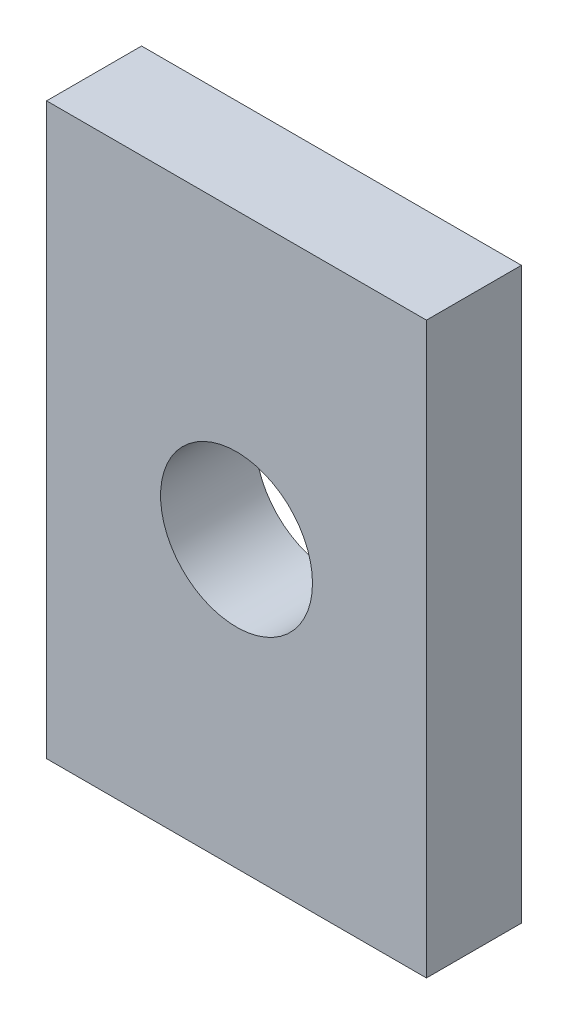
ISO-10303-21;
HEADER;
FILE_DESCRIPTION(('STEP AP214'),'2;1');
FILE_NAME('part.step','',(''),(''),'','','');
FILE_SCHEMA(('AUTOMOTIVE_DESIGN { 1 0 10303 214 1 1 1 1 }'));
ENDSEC;
DATA;
#1=APPLICATION_CONTEXT('core data for automotive mechanical design processes');
#2=APPLICATION_PROTOCOL_DEFINITION('international standard','automotive_design',2000,#1);
#3=PRODUCT_CONTEXT('',#1,'mechanical');
#4=PRODUCT('Part','Part','',(#3));
#5=PRODUCT_RELATED_PRODUCT_CATEGORY('part','',(#4));
#6=PRODUCT_DEFINITION_FORMATION('','',#4);
#7=PRODUCT_DEFINITION_CONTEXT('part definition',#1,'design');
#8=PRODUCT_DEFINITION('design','',#6,#7);
#9=PRODUCT_DEFINITION_SHAPE('','',#8);
#10=(LENGTH_UNIT() NAMED_UNIT(*) SI_UNIT(.MILLI.,.METRE.));
#11=(NAMED_UNIT(*) PLANE_ANGLE_UNIT() SI_UNIT($,.RADIAN.));
#12=(NAMED_UNIT(*) SI_UNIT($,.STERADIAN.) SOLID_ANGLE_UNIT());
#13=UNCERTAINTY_MEASURE_WITH_UNIT(LENGTH_MEASURE(1.E-05),#10,'distance_accuracy_value','');
#14=(GEOMETRIC_REPRESENTATION_CONTEXT(3) GLOBAL_UNCERTAINTY_ASSIGNED_CONTEXT((#13)) GLOBAL_UNIT_ASSIGNED_CONTEXT((#10,
#11,#12)) REPRESENTATION_CONTEXT('',''));
#15=CARTESIAN_POINT('',(0.,0.,0.));
#16=DIRECTION('',(0.,0.,1.));
#17=DIRECTION('',(1.,0.,0.));
#18=AXIS2_PLACEMENT_3D('',#15,#16,#17);
#19=CARTESIAN_POINT('',(-10.,15.,5.));
#20=DIRECTION('',(1.,0.,0.));
#21=DIRECTION('',(0.,1.,0.));
#22=AXIS2_PLACEMENT_3D('',#19,#20,#21);
#23=PLANE('',#22);
#24=DIRECTION('',(0.,-1.,0.));
#25=VECTOR('',#24,1.);
#26=CARTESIAN_POINT('',(-10.,15.,0.));
#27=LINE('',#26,#25);
#28=CARTESIAN_POINT('',(-10.,15.,0.));
#29=VERTEX_POINT('',#28);
#30=CARTESIAN_POINT('',(-10.,-15.,0.));
#31=VERTEX_POINT('',#30);
#32=EDGE_CURVE('E98',#29,#31,#27,.T.);
#33=ORIENTED_EDGE('',*,*,#32,.T.);
#34=DIRECTION('',(0.,0.,-1.));
#35=VECTOR('',#34,1.);
#36=CARTESIAN_POINT('',(-10.,-15.,5.));
#37=LINE('',#36,#35);
#38=CARTESIAN_POINT('',(-10.,-15.,5.));
#39=VERTEX_POINT('',#38);
#40=EDGE_CURVE('E11',#39,#31,#37,.T.);
#41=ORIENTED_EDGE('',*,*,#40,.F.);
#42=DIRECTION('',(0.,-1.,0.));
#43=VECTOR('',#42,1.);
#44=CARTESIAN_POINT('',(-10.,15.,5.));
#45=LINE('',#44,#43);
#46=CARTESIAN_POINT('',(-10.,15.,5.));
#47=VERTEX_POINT('',#46);
#48=EDGE_CURVE('E85',#47,#39,#45,.T.);
#49=ORIENTED_EDGE('',*,*,#48,.F.);
#50=DIRECTION('',(0.,0.,-1.));
#51=VECTOR('',#50,1.);
#52=CARTESIAN_POINT('',(-10.,15.,5.));
#53=LINE('',#52,#51);
#54=EDGE_CURVE('E94',#47,#29,#53,.T.);
#55=ORIENTED_EDGE('',*,*,#54,.T.);
#56=EDGE_LOOP('',(#33,#41,#49,#55));
#57=FACE_BOUND('',#56,.T.);
#58=ADVANCED_FACE('F33',(#57),#23,.F.);
#59=CARTESIAN_POINT('',(-10.,-15.,5.));
#60=DIRECTION('',(0.,1.,0.));
#61=DIRECTION('',(0.,0.,1.));
#62=AXIS2_PLACEMENT_3D('',#59,#60,#61);
#63=PLANE('',#62);
#64=DIRECTION('',(1.,0.,0.));
#65=VECTOR('',#64,1.);
#66=CARTESIAN_POINT('',(-10.,-15.,0.));
#67=LINE('',#66,#65);
#68=CARTESIAN_POINT('',(10.,-15.,0.));
#69=VERTEX_POINT('',#68);
#70=EDGE_CURVE('E89',#31,#69,#67,.T.);
#71=ORIENTED_EDGE('',*,*,#70,.T.);
#72=DIRECTION('',(0.,0.,-1.));
#73=VECTOR('',#72,1.);
#74=CARTESIAN_POINT('',(10.,-15.,5.));
#75=LINE('',#74,#73);
#76=CARTESIAN_POINT('',(10.,-15.,5.));
#77=VERTEX_POINT('',#76);
#78=EDGE_CURVE('E42',#77,#69,#75,.T.);
#79=ORIENTED_EDGE('',*,*,#78,.F.);
#80=DIRECTION('',(1.,0.,0.));
#81=VECTOR('',#80,1.);
#82=CARTESIAN_POINT('',(-10.,-15.,5.));
#83=LINE('',#82,#81);
#84=EDGE_CURVE('E80',#39,#77,#83,.T.);
#85=ORIENTED_EDGE('',*,*,#84,.F.);
#86=ORIENTED_EDGE('',*,*,#40,.T.);
#87=EDGE_LOOP('',(#71,#79,#85,#86));
#88=FACE_BOUND('',#87,.T.);
#89=ADVANCED_FACE('F88',(#88),#63,.F.);
#90=CARTESIAN_POINT('',(10.,15.,5.));
#91=DIRECTION('',(-1.,0.,0.));
#92=DIRECTION('',(0.,-1.,0.));
#93=AXIS2_PLACEMENT_3D('',#90,#91,#92);
#94=PLANE('',#93);
#95=DIRECTION('',(0.,1.,0.));
#96=VECTOR('',#95,1.);
#97=CARTESIAN_POINT('',(10.,15.,0.));
#98=LINE('',#97,#96);
#99=CARTESIAN_POINT('',(10.,15.,0.));
#100=VERTEX_POINT('',#99);
#101=EDGE_CURVE('E67',#69,#100,#98,.T.);
#102=ORIENTED_EDGE('',*,*,#101,.T.);
#103=DIRECTION('',(0.,0.,-1.));
#104=VECTOR('',#103,1.);
#105=CARTESIAN_POINT('',(10.,15.,5.));
#106=LINE('',#105,#104);
#107=CARTESIAN_POINT('',(10.,15.,5.));
#108=VERTEX_POINT('',#107);
#109=EDGE_CURVE('E90',#108,#100,#106,.T.);
#110=ORIENTED_EDGE('',*,*,#109,.F.);
#111=DIRECTION('',(0.,1.,0.));
#112=VECTOR('',#111,1.);
#113=CARTESIAN_POINT('',(10.,15.,5.));
#114=LINE('',#113,#112);
#115=EDGE_CURVE('E83',#77,#108,#114,.T.);
#116=ORIENTED_EDGE('',*,*,#115,.F.);
#117=ORIENTED_EDGE('',*,*,#78,.T.);
#118=EDGE_LOOP('',(#102,#110,#116,#117));
#119=FACE_BOUND('',#118,.T.);
#120=ADVANCED_FACE('F92',(#119),#94,.F.);
#121=CARTESIAN_POINT('',(-10.,15.,5.));
#122=DIRECTION('',(0.,-1.,0.));
#123=DIRECTION('',(1.,0.,0.));
#124=AXIS2_PLACEMENT_3D('',#121,#122,#123);
#125=PLANE('',#124);
#126=DIRECTION('',(-1.,0.,0.));
#127=VECTOR('',#126,1.);
#128=CARTESIAN_POINT('',(-10.,15.,0.));
#129=LINE('',#128,#127);
#130=EDGE_CURVE('E73',#100,#29,#129,.T.);
#131=ORIENTED_EDGE('',*,*,#130,.T.);
#132=ORIENTED_EDGE('',*,*,#54,.F.);
#133=DIRECTION('',(-1.,0.,0.));
#134=VECTOR('',#133,1.);
#135=CARTESIAN_POINT('',(-10.,15.,5.));
#136=LINE('',#135,#134);
#137=EDGE_CURVE('E50',#108,#47,#136,.T.);
#138=ORIENTED_EDGE('',*,*,#137,.F.);
#139=ORIENTED_EDGE('',*,*,#109,.T.);
#140=EDGE_LOOP('',(#131,#132,#138,#139));
#141=FACE_BOUND('',#140,.T.);
#142=ADVANCED_FACE('F105',(#141),#125,.F.);
#143=CARTESIAN_POINT('',(0.,0.,5.));
#144=DIRECTION('',(0.,0.,1.));
#145=DIRECTION('',(1.,0.,0.));
#146=AXIS2_PLACEMENT_3D('',#143,#144,#145);
#147=PLANE('',#146);
#148=CARTESIAN_POINT('',(0.,0.,5.));
#149=DIRECTION('',(0.,0.,1.));
#150=DIRECTION('',(1.,0.,0.));
#151=AXIS2_PLACEMENT_3D('',#148,#149,#150);
#152=CIRCLE('',#151,4.);
#153=CARTESIAN_POINT('',(4.,0.,5.));
#154=VERTEX_POINT('',#153);
#155=EDGE_CURVE('E111',#154,#154,#152,.T.);
#156=ORIENTED_EDGE('',*,*,#155,.F.);
#157=EDGE_LOOP('',(#156));
#158=FACE_BOUND('',#157,.T.);
#159=ORIENTED_EDGE('',*,*,#48,.T.);
#160=ORIENTED_EDGE('',*,*,#84,.T.);
#161=ORIENTED_EDGE('',*,*,#115,.T.);
#162=ORIENTED_EDGE('',*,*,#137,.T.);
#163=EDGE_LOOP('',(#159,#160,#161,#162));
#164=FACE_BOUND('',#163,.T.);
#165=ADVANCED_FACE('F81',(#158,#164),#147,.T.);
#166=CARTESIAN_POINT('',(0.,0.,0.));
#167=DIRECTION('',(0.,0.,1.));
#168=DIRECTION('',(1.,0.,0.));
#169=AXIS2_PLACEMENT_3D('',#166,#167,#168);
#170=PLANE('',#169);
#171=CARTESIAN_POINT('',(0.,0.,0.));
#172=DIRECTION('',(0.,0.,1.));
#173=DIRECTION('',(1.,0.,0.));
#174=AXIS2_PLACEMENT_3D('',#171,#172,#173);
#175=CIRCLE('',#174,4.);
#176=CARTESIAN_POINT('',(4.,0.,0.));
#177=VERTEX_POINT('',#176);
#178=EDGE_CURVE('E36',#177,#177,#175,.T.);
#179=ORIENTED_EDGE('',*,*,#178,.T.);
#180=EDGE_LOOP('',(#179));
#181=FACE_BOUND('',#180,.T.);
#182=ORIENTED_EDGE('',*,*,#32,.F.);
#183=ORIENTED_EDGE('',*,*,#130,.F.);
#184=ORIENTED_EDGE('',*,*,#101,.F.);
#185=ORIENTED_EDGE('',*,*,#70,.F.);
#186=EDGE_LOOP('',(#182,#183,#184,#185));
#187=FACE_BOUND('',#186,.T.);
#188=ADVANCED_FACE('F108',(#181,#187),#170,.F.);
#189=CARTESIAN_POINT('',(0.,0.,-5.));
#190=DIRECTION('',(0.,0.,1.));
#191=DIRECTION('',(1.,0.,0.));
#192=AXIS2_PLACEMENT_3D('',#189,#190,#191);
#193=CYLINDRICAL_SURFACE('',#192,4.);
#194=ORIENTED_EDGE('',*,*,#155,.T.);
#195=EDGE_LOOP('',(#194));
#196=FACE_BOUND('',#195,.T.);
#197=ORIENTED_EDGE('',*,*,#178,.F.);
#198=EDGE_LOOP('',(#197));
#199=FACE_BOUND('',#198,.T.);
#200=ADVANCED_FACE('F119',(#196,#199),#193,.F.);
#201=CLOSED_SHELL('',(#58,#89,#120,#142,#165,#188,#200));
#202=MANIFOLD_SOLID_BREP('B2',#201);
#203=ADVANCED_BREP_SHAPE_REPRESENTATION('',(#18,#202),#14);
#204=SHAPE_DEFINITION_REPRESENTATION(#9,#203);
ENDSEC;
END-ISO-10303-21;
